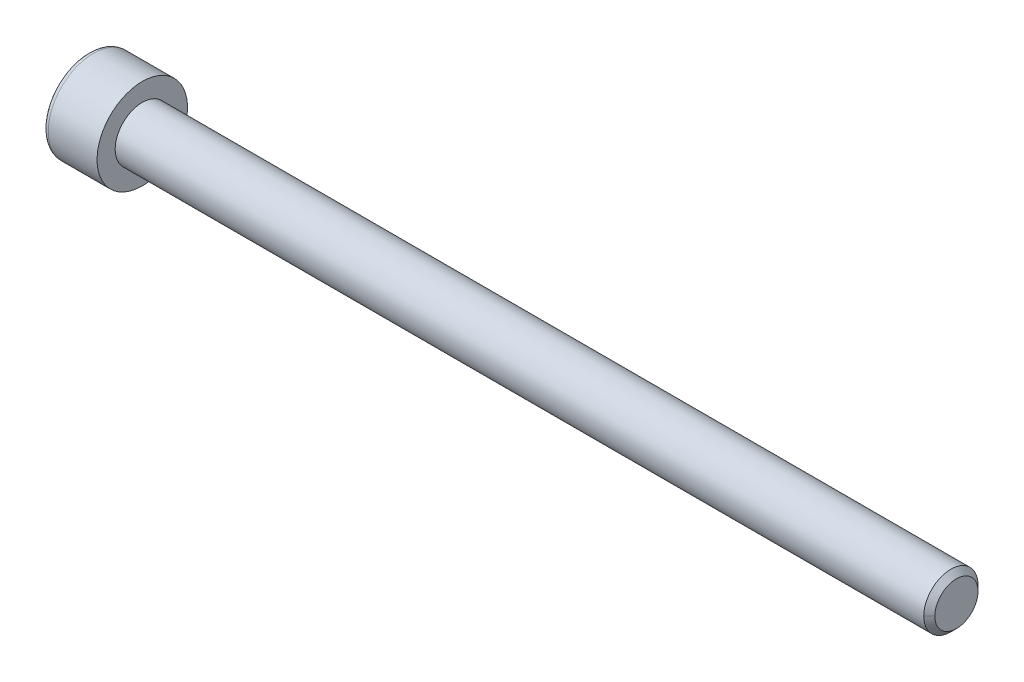
ISO-10303-21;
HEADER;
FILE_DESCRIPTION(('STEP AP214'),'2;1');
FILE_NAME('part.step','',(''),(''),'','','');
FILE_SCHEMA(('AUTOMOTIVE_DESIGN { 1 0 10303 214 1 1 1 1 }'));
ENDSEC;
DATA;
#1=APPLICATION_CONTEXT('core data for automotive mechanical design processes');
#2=APPLICATION_PROTOCOL_DEFINITION('international standard','automotive_design',2000,#1);
#3=PRODUCT_CONTEXT('',#1,'mechanical');
#4=PRODUCT('Part','Part','',(#3));
#5=PRODUCT_RELATED_PRODUCT_CATEGORY('part','',(#4));
#6=PRODUCT_DEFINITION_FORMATION('','',#4);
#7=PRODUCT_DEFINITION_CONTEXT('part definition',#1,'design');
#8=PRODUCT_DEFINITION('design','',#6,#7);
#9=PRODUCT_DEFINITION_SHAPE('','',#8);
#10=(LENGTH_UNIT() NAMED_UNIT(*) SI_UNIT(.MILLI.,.METRE.));
#11=(NAMED_UNIT(*) PLANE_ANGLE_UNIT() SI_UNIT($,.RADIAN.));
#12=(NAMED_UNIT(*) SI_UNIT($,.STERADIAN.) SOLID_ANGLE_UNIT());
#13=UNCERTAINTY_MEASURE_WITH_UNIT(LENGTH_MEASURE(1.E-05),#10,'distance_accuracy_value','');
#14=(GEOMETRIC_REPRESENTATION_CONTEXT(3) GLOBAL_UNCERTAINTY_ASSIGNED_CONTEXT((#13)) GLOBAL_UNIT_ASSIGNED_CONTEXT((#10,
#11,#12)) REPRESENTATION_CONTEXT('',''));
#15=CARTESIAN_POINT('',(0.,0.,0.));
#16=DIRECTION('',(0.,0.,1.));
#17=DIRECTION('',(1.,0.,0.));
#18=AXIS2_PLACEMENT_3D('',#15,#16,#17);
#19=CARTESIAN_POINT('',(90.,-2.4151886,2.4151886));
#20=DIRECTION('',(1.,0.,0.));
#21=DIRECTION('',(0.,1.,0.));
#22=AXIS2_PLACEMENT_3D('',#19,#20,#21);
#23=PLANE('',#22);
#24=CARTESIAN_POINT('',(90.,0.,0.));
#25=DIRECTION('',(1.,0.,0.));
#26=DIRECTION('',(0.,0.,-1.));
#27=AXIS2_PLACEMENT_3D('',#24,#25,#26);
#28=CIRCLE('',#27,2.38655);
#29=CARTESIAN_POINT('',(90.,-8.15815978925338E-10,2.38655000000001));
#30=VERTEX_POINT('',#29);
#31=CARTESIAN_POINT('',(90.,-2.85727898792781E-10,-2.38655000000001));
#32=VERTEX_POINT('',#31);
#33=EDGE_CURVE('E128',#30,#32,#28,.F.);
#34=ORIENTED_EDGE('',*,*,#33,.F.);
#35=CARTESIAN_POINT('',(90.,0.,0.));
#36=DIRECTION('',(1.,0.,0.));
#37=DIRECTION('',(0.,0.,-1.));
#38=AXIS2_PLACEMENT_3D('',#35,#36,#37);
#39=CIRCLE('',#38,2.38655);
#40=EDGE_CURVE('E57',#32,#30,#39,.F.);
#41=ORIENTED_EDGE('',*,*,#40,.F.);
#42=EDGE_LOOP('',(#34,#41));
#43=FACE_BOUND('',#42,.T.);
#44=ADVANCED_FACE('F53',(#43),#23,.T.);
#45=CARTESIAN_POINT('',(90.,0.,-2.38655));
#46=CARTESIAN_POINT('',(89.38655,0.,-3.));
#47=(BOUNDED_CURVE() B_SPLINE_CURVE(1,(#45,#46),.UNSPECIFIED.,.F.,
.F.) B_SPLINE_CURVE_WITH_KNOTS((2,2),(0.,1.00000000000009),
.UNSPECIFIED.) CURVE() GEOMETRIC_REPRESENTATION_ITEM() RATIONAL_B_SPLINE_CURVE((1.,1.)) REPRESENTATION_ITEM(''));
#48=CARTESIAN_POINT('',(1089.38655,0.,0.));
#49=DIRECTION('',(-1.,0.,0.));
#50=AXIS1_PLACEMENT('',#48,#49);
#51=SURFACE_OF_REVOLUTION('',#47,#50);
#52=ORIENTED_EDGE('',*,*,#40,.T.);
#53=DIRECTION('',(0.707106781186548,2.90060050295602E-10,-0.707106781186547));
#54=VECTOR('',#53,1.);
#55=CARTESIAN_POINT('',(89.693275,-1.10479987286926E-09,2.693275));
#56=LINE('',#55,#54);
#57=CARTESIAN_POINT('',(89.38655,-1.23062057109199E-09,3.00000000000002));
#58=VERTEX_POINT('',#57);
#59=EDGE_CURVE('E125',#58,#30,#56,.T.);
#60=ORIENTED_EDGE('',*,*,#59,.F.);
#61=CARTESIAN_POINT('',(89.38655,0.,0.));
#62=DIRECTION('',(1.,0.,0.));
#63=DIRECTION('',(0.,0.,-1.));
#64=AXIS2_PLACEMENT_3D('',#61,#62,#63);
#65=CIRCLE('',#64,3.);
#66=CARTESIAN_POINT('',(89.38655,-2.69379553018573E-10,-3.00000000000002));
#67=VERTEX_POINT('',#66);
#68=EDGE_CURVE('E134',#67,#58,#65,.F.);
#69=ORIENTED_EDGE('',*,*,#68,.F.);
#70=DIRECTION('',(-0.707106781186548,-1.26986739101621E-10,-0.707106781186547));
#71=VECTOR('',#70,1.);
#72=CARTESIAN_POINT('',(89.693275,-4.83675477104059E-10,-2.693275));
#73=LINE('',#72,#71);
#74=EDGE_CURVE('E119',#32,#67,#73,.T.);
#75=ORIENTED_EDGE('',*,*,#74,.F.);
#76=EDGE_LOOP('',(#52,#60,#69,#75));
#77=FACE_BOUND('',#76,.T.);
#78=ADVANCED_FACE('F132',(#77),#51,.T.);
#79=CARTESIAN_POINT('',(90.0001414213562,0.,-2.38640857864376));
#80=CARTESIAN_POINT('',(90.,0.,-2.38655));
#81=CARTESIAN_POINT('',(89.38655,0.,-3.));
#82=(BOUNDED_CURVE() B_SPLINE_CURVE(1,(#79,#80,#81),.UNSPECIFIED.,.F.,
.F.) B_SPLINE_CURVE_WITH_KNOTS((2,1,2),(-0.00023053439469535,5.18446733999951E-11,1.),
.UNSPECIFIED.) CURVE() GEOMETRIC_REPRESENTATION_ITEM() RATIONAL_B_SPLINE_CURVE((1.,1.,1.)) REPRESENTATION_ITEM(''));
#83=CARTESIAN_POINT('',(1089.38655,0.,0.));
#84=DIRECTION('',(-1.,0.,0.));
#85=AXIS1_PLACEMENT('',#83,#84);
#86=SURFACE_OF_REVOLUTION('',#82,#85);
#87=ORIENTED_EDGE('',*,*,#59,.T.);
#88=ORIENTED_EDGE('',*,*,#33,.T.);
#89=ORIENTED_EDGE('',*,*,#74,.T.);
#90=CARTESIAN_POINT('',(89.38655,0.,0.));
#91=DIRECTION('',(1.,0.,0.));
#92=DIRECTION('',(0.,0.,-1.));
#93=AXIS2_PLACEMENT_3D('',#90,#91,#92);
#94=CIRCLE('',#93,3.);
#95=EDGE_CURVE('E129',#58,#67,#94,.F.);
#96=ORIENTED_EDGE('',*,*,#95,.F.);
#97=EDGE_LOOP('',(#87,#88,#89,#96));
#98=FACE_BOUND('',#97,.T.);
#99=ADVANCED_FACE('F126',(#98),#86,.T.);
#100=CARTESIAN_POINT('',(-1.333333333,0.,0.));
#101=CARTESIAN_POINT('',(-3.01,0.,-2.904071854));
#102=(BOUNDED_CURVE() B_SPLINE_CURVE(1,(#100,#101),.UNSPECIFIED.,.F.,
.F.) B_SPLINE_CURVE_WITH_KNOTS((2,2),(0.,1.),
.UNSPECIFIED.) CURVE() GEOMETRIC_REPRESENTATION_ITEM() RATIONAL_B_SPLINE_CURVE((1.,1.)) REPRESENTATION_ITEM(''));
#103=CARTESIAN_POINT('',(996.99,0.,0.));
#104=DIRECTION('',(-1.,0.,0.));
#105=AXIS1_PLACEMENT('',#103,#104);
#106=SURFACE_OF_REVOLUTION('',#102,#105);
#107=CARTESIAN_POINT('',(-1.333333333,0.,0.));
#108=VERTEX_POINT('',#107);
#109=VERTEX_LOOP('',#108);
#110=FACE_BOUND('',#109,.T.);
#111=CARTESIAN_POINT('',(-2.99999999990194,-2.5,1.44337567259391));
#112=CARTESIAN_POINT('',(-2.98209574263693,-2.5,1.38134905294953));
#113=CARTESIAN_POINT('',(-2.96498591501795,-2.5,1.31908524854831));
#114=CARTESIAN_POINT('',(-2.9325586063815,-2.5,1.19402341340579));
#115=CARTESIAN_POINT('',(-2.91724304001177,-2.5,1.13122488732653));
#116=CARTESIAN_POINT('',(-2.88864230481174,-2.5,1.00514627159482));
#117=CARTESIAN_POINT('',(-2.87535773971234,-2.5,0.941866044598566));
#118=CARTESIAN_POINT('',(-2.84501155623976,-2.5,0.783295355537952));
#119=CARTESIAN_POINT('',(-2.82935510407788,-2.5,0.687729720023883));
#120=CARTESIAN_POINT('',(-2.8038363929103,-2.5,0.49582792968208));
#121=CARTESIAN_POINT('',(-2.79397345365601,-2.5,0.399491866661438));
#122=CARTESIAN_POINT('',(-2.78132126682311,-2.5,0.217329774455165));
#123=CARTESIAN_POINT('',(-2.77785668029329,-2.5,0.13155078285884));
#124=CARTESIAN_POINT('',(-2.77604418751081,-2.5,-0.0400958904405022));
#125=CARTESIAN_POINT('',(-2.77769824160356,-2.5,-0.125963593529663));
#126=CARTESIAN_POINT('',(-2.78605196619317,-2.5,-0.297450074329791));
#127=CARTESIAN_POINT('',(-2.79275167480722,-2.5,-0.383068850155342));
#128=CARTESIAN_POINT('',(-2.8108998117244,-2.5,-0.553755303851712));
#129=CARTESIAN_POINT('',(-2.82234605098717,-2.5,-0.638823217429646));
#130=CARTESIAN_POINT('',(-2.84954081955049,-2.5,-0.808258474159647));
#131=CARTESIAN_POINT('',(-2.86528928104194,-2.5,-0.892625828331925));
#132=CARTESIAN_POINT('',(-2.90056247218591,-2.5,-1.06053688925276));
#133=CARTESIAN_POINT('',(-2.92008612509887,-2.5,-1.14408082372909));
#134=CARTESIAN_POINT('',(-2.95044571186063,-2.5,-1.26341360873709));
#135=CARTESIAN_POINT('',(-2.95996603514937,-2.5,-1.29954359668296));
#136=CARTESIAN_POINT('',(-2.9795691964924,-2.5,-1.37159959189587));
#137=CARTESIAN_POINT('',(-2.98965127625646,-2.5,-1.40752580531338));
#138=CARTESIAN_POINT('',(-2.99999999995315,-2.5,-1.44337567277131));
#139=B_SPLINE_CURVE_WITH_KNOTS('',3,(#111,#112,#113,#114,#115,#116,#117,#118,#119,#120,#121,
#122,#123,#124,#125,#126,#127,#128,#129,#130,#131,#132,#133,#134,#135,#136,#137,#138),
.UNSPECIFIED.,.F.,.F.,(4,2,2,2,2,2,2,2,2,2,2,2,2,4),(0.,0.193683427773067,0.38757168712609,
0.581517469676064,0.871873940003063,1.16219631114209,1.41959520256128,1.67709268522974,
1.93459211317248,2.1919729174537,2.44934966528471,2.70665311350898,2.81873929256059,
2.93067767377976),.UNSPECIFIED.);
#140=CARTESIAN_POINT('',(-2.99999999985056,-2.49999999997164,1.44337567301637));
#141=VERTEX_POINT('',#140);
#142=CARTESIAN_POINT('',(-2.9999999999511,-2.49999999989483,-1.44337567294638));
#143=VERTEX_POINT('',#142);
#144=EDGE_CURVE('E489',#141,#143,#139,.T.);
#145=ORIENTED_EDGE('',*,*,#144,.F.);
#146=CARTESIAN_POINT('',(-2.99999999981082,-6.92430306305458E-10,2.88675134560023));
#147=CARTESIAN_POINT('',(-2.98209574255005,-0.0537166290131819,2.85573803577872));
#148=CARTESIAN_POINT('',(-2.96498591493549,-0.107638665358749,2.8246061335788));
#149=CARTESIAN_POINT('',(-2.93255860630814,-0.215945391631711,2.76207521600893));
#150=CARTESIAN_POINT('',(-2.9172430399431,-0.270330510534358,2.73067595297002));
#151=CARTESIAN_POINT('',(-2.88864230475259,-0.379517794627478,2.66763664510564));
#152=CARTESIAN_POINT('',(-2.87535773965803,-0.43432007876117,2.63599653160827));
#153=CARTESIAN_POINT('',(-2.84501155619788,-0.571646323777089,2.55671118708011));
#154=CARTESIAN_POINT('',(-2.82935510404371,-0.654408591857143,2.50892836932449));
#155=CARTESIAN_POINT('',(-2.8038363928916,-0.820600417316618,2.41297747415662));
#156=CARTESIAN_POINT('',(-2.79397345364506,-0.904029895188767,2.36480944264792));
#157=CARTESIAN_POINT('',(-2.78132126682574,-1.06178689464532,2.27372839654349));
#158=CARTESIAN_POINT('',(-2.77785668030231,-1.13607368048253,2.23083890074238));
#159=CARTESIAN_POINT('',(-2.7760441875333,-1.28472406004208,2.14501556408699));
#160=CARTESIAN_POINT('',(-2.77769824163313,-1.35908767228535,2.10208171253965));
#161=CARTESIAN_POINT('',(-2.78605196623694,-1.5075993210704,2.01633847213427));
#162=CARTESIAN_POINT('',(-2.79275167485812,-1.58174735597935,1.97352908421893));
#163=CARTESIAN_POINT('',(-2.81089981178956,-1.72956616096821,1.88818585736579));
#164=CARTESIAN_POINT('',(-2.82234605105948,-1.80323713517648,1.84565190057442));
#165=CARTESIAN_POINT('',(-2.84954081963674,-1.94997237180682,1.76093427220477));
#166=CARTESIAN_POINT('',(-2.86528928113499,-2.02303664377268,1.71875059511638));
#167=CARTESIAN_POINT('',(-2.90056247229208,-2.16845188811155,1.63479506465155));
#168=CARTESIAN_POINT('',(-2.92008612521135,-2.2408030577026,1.59302309741122));
#169=CARTESIAN_POINT('',(-2.95044571196894,-2.34414828098353,1.53335670492944));
#170=CARTESIAN_POINT('',(-2.95996603524654,-2.37543776834049,1.51529171098077));
#171=CARTESIAN_POINT('',(-2.9795691965657,-2.43784009060514,1.47926371342257));
#172=CARTESIAN_POINT('',(-2.98965127631702,-2.46895310404436,1.46130060673781));
#173=CARTESIAN_POINT('',(-3.00000000000026,-2.49999999994328,1.44337567303274));
#174=B_SPLINE_CURVE_WITH_KNOTS('',3,(#146,#147,#148,#149,#150,#151,#152,#153,#154,#155,#156,
#157,#158,#159,#160,#161,#162,#163,#164,#165,#166,#167,#168,#169,#170,#171,#172,#173),
.UNSPECIFIED.,.F.,.F.,(4,2,2,2,2,2,2,2,2,2,2,2,2,4),(0.,0.193683427763163,0.387571687106229,
0.581517469646224,0.871873939957275,1.16219631108039,1.41959520251302,1.67709268519497,
1.93459211315123,2.19197291744619,2.44934966529089,2.70665311352883,2.8187392924298,
2.93067767349862),.UNSPECIFIED.);
#175=CARTESIAN_POINT('',(-3.00000000004163,-1.18416519667169E-09,2.886751346));
#176=VERTEX_POINT('',#175);
#177=EDGE_CURVE('E140',#176,#141,#174,.T.);
#178=ORIENTED_EDGE('',*,*,#177,.F.);
#179=CARTESIAN_POINT('',(-3.00000000004014,2.50000000006292,1.44337567296367));
#180=CARTESIAN_POINT('',(-2.98209574277019,2.44628337173678,1.47438898278829));
#181=CARTESIAN_POINT('',(-2.96498591514619,2.39236133538579,1.50552088499134));
#182=CARTESIAN_POINT('',(-2.93255860649956,2.28405460910186,1.56805180256754));
#183=CARTESIAN_POINT('',(-2.91724304012469,2.22966949019366,1.59945106560966));
#184=CARTESIAN_POINT('',(-2.88864230491419,2.12048220608924,1.66249037348057));
#185=CARTESIAN_POINT('',(-2.87535773980948,2.0656799219498,1.69413048698125));
#186=CARTESIAN_POINT('',(-2.8450115563234,1.92835367691897,1.77341583151802));
#187=CARTESIAN_POINT('',(-2.82935510415318,1.84559140882962,1.82119864927901));
#188=CARTESIAN_POINT('',(-2.80383639296923,1.67939958335076,1.91714954445807));
#189=CARTESIAN_POINT('',(-2.7939734537069,1.59597010546853,1.96531757597259));
#190=CARTESIAN_POINT('',(-2.78132126685985,1.43821310600813,2.05639862207924));
#191=CARTESIAN_POINT('',(-2.77785668032333,1.36392632017731,2.09928811787666));
#192=CARTESIAN_POINT('',(-2.77604418752705,1.21527594062986,2.18511145452507));
#193=CARTESIAN_POINT('',(-2.7776982416127,1.14091232839229,2.22804530606911));
#194=CARTESIAN_POINT('',(-2.78605196618806,0.992400679617963,2.31378854646831));
#195=CARTESIAN_POINT('',(-2.79275167479497,0.918252644714026,2.35659793438075));
#196=CARTESIAN_POINT('',(-2.81089981169805,0.77043383973447,2.44194116122851));
#197=CARTESIAN_POINT('',(-2.82234605095387,0.696762865530502,2.4844751180174));
#198=CARTESIAN_POINT('',(-2.84954081950371,0.55002762890825,2.56919274638238));
#199=CARTESIAN_POINT('',(-2.86528928098864,0.476963356946185,2.61137642346858));
#200=CARTESIAN_POINT('',(-2.90056247212028,0.331548112614633,2.69533195392919));
#201=CARTESIAN_POINT('',(-2.92008612502744,0.259196943027112,2.73710392116748));
#202=CARTESIAN_POINT('',(-2.95044571181407,0.155851719595239,2.79677031373641));
#203=CARTESIAN_POINT('',(-2.95996603513553,0.124562232084562,2.81483530777383));
#204=CARTESIAN_POINT('',(-2.97956919654802,0.0621599095141735,2.85086330550854));
#205=CARTESIAN_POINT('',(-2.98965127634881,0.0310468959229215,2.86882641228108));
#206=CARTESIAN_POINT('',(-3.00000000008409,-1.27376694826501E-10,2.88675134607354));
#207=B_SPLINE_CURVE_WITH_KNOTS('',3,(#179,#180,#181,#182,#183,#184,#185,#186,#187,#188,#189,
#190,#191,#192,#193,#194,#195,#196,#197,#198,#199,#200,#201,#202,#203,#204,#205,#206),
.UNSPECIFIED.,.F.,.F.,(4,2,2,2,2,2,2,2,2,2,2,2,2,4),(0.,0.193683427788764,0.387571687157534,
0.581517469723277,0.87187394007394,1.16219631123659,1.41959520264876,1.67709268531015,
1.93459211324574,2.19197291752029,2.44934966534468,2.70665311356242,2.81873929301174,
2.93067767462766),.UNSPECIFIED.);
#208=CARTESIAN_POINT('',(-2.9999999999511,2.50000000003146,1.44337567270972));
#209=VERTEX_POINT('',#208);
#210=EDGE_CURVE('E142',#209,#176,#207,.T.);
#211=ORIENTED_EDGE('',*,*,#210,.F.);
#212=CARTESIAN_POINT('',(-2.99999999999303,2.5,-1.44337567290945));
#213=CARTESIAN_POINT('',(-2.98209574272447,2.5,-1.38134905326268));
#214=CARTESIAN_POINT('',(-2.96498591510176,2.5,-1.31908524885907));
#215=CARTESIAN_POINT('',(-2.93255860645764,2.5,-1.19402341371172));
#216=CARTESIAN_POINT('',(-2.91724304008399,2.5,-1.13122488763002));
#217=CARTESIAN_POINT('',(-2.88864230487602,2.5,-1.00514627189332));
#218=CARTESIAN_POINT('',(-2.87535773977261,2.5,-0.94186604489453));
#219=CARTESIAN_POINT('',(-2.84501155628974,2.5,-0.783295355827017));
#220=CARTESIAN_POINT('',(-2.82935510412148,2.5,-0.687729720308527));
#221=CARTESIAN_POINT('',(-2.80383639294123,2.5,-0.495827929957529));
#222=CARTESIAN_POINT('',(-2.79397345368064,2.5,-0.399491866932111));
#223=CARTESIAN_POINT('',(-2.78132126683661,2.5,-0.217329774723812));
#224=CARTESIAN_POINT('',(-2.7778566803015,2.5,-0.131550783130307));
#225=CARTESIAN_POINT('',(-2.77604418750818,2.5,0.0400958901637057));
#226=CARTESIAN_POINT('',(-2.77769824159537,2.5,0.125963593250358));
#227=CARTESIAN_POINT('',(-2.7860519661738,2.5,0.29745007404579));
#228=CARTESIAN_POINT('',(-2.79275167478224,2.5,0.383068849869153));
#229=CARTESIAN_POINT('',(-2.81089981168823,2.5,0.553755303561258));
#230=CARTESIAN_POINT('',(-2.82234605094543,2.5,0.638823217137117));
#231=CARTESIAN_POINT('',(-2.84954081949781,2.5,0.808258473863209));
#232=CARTESIAN_POINT('',(-2.8652892809839,2.5,0.892625828033653));
#233=CARTESIAN_POINT('',(-2.90056247211773,2.5,1.06053688895091));
#234=CARTESIAN_POINT('',(-2.9200861250259,2.5,1.14408082342549));
#235=CARTESIAN_POINT('',(-2.95044571178066,2.5,1.26341360843007));
#236=CARTESIAN_POINT('',(-2.95996603506711,2.5,1.29954359637421));
#237=CARTESIAN_POINT('',(-2.97956919640564,2.5,1.37159959158371));
#238=CARTESIAN_POINT('',(-2.9896512761675,2.5,1.40752580499953));
#239=CARTESIAN_POINT('',(-2.99999999986206,2.5,1.44337567245577));
#240=B_SPLINE_CURVE_WITH_KNOTS('',3,(#212,#213,#214,#215,#216,#217,#218,#219,#220,#221,#222,
#223,#224,#225,#226,#227,#228,#229,#230,#231,#232,#233,#234,#235,#236,#237,#238,#239),
.UNSPECIFIED.,.F.,.F.,(4,2,2,2,2,2,2,2,2,2,2,2,2,4),(0.,0.193683427782941,0.387571687145881,
0.581517469705791,0.871873940048986,1.16219631120418,1.41959520261558,1.6770926852762,
1.93459211321108,2.19197291748389,2.44934966530652,2.70665311352239,2.81873929256726,
2.93067767377976),.UNSPECIFIED.);
#241=CARTESIAN_POINT('',(-2.9999999999511,2.49999999983501,-1.44337567304999));
#242=VERTEX_POINT('',#241);
#243=EDGE_CURVE('E521',#242,#209,#240,.T.);
#244=ORIENTED_EDGE('',*,*,#243,.F.);
#245=CARTESIAN_POINT('',(-2.99999999997736,1.9280147525356E-10,-2.88675134588869));
#246=CARTESIAN_POINT('',(-2.98209574271006,0.05371662851739,-2.85573803606497));
#247=CARTESIAN_POINT('',(-2.96498591508868,0.107638664866787,-2.82460613386283));
#248=CARTESIAN_POINT('',(-2.93255860644731,0.215945391147497,-2.76207521628849));
#249=CARTESIAN_POINT('',(-2.91724304007509,0.27033051005406,-2.73067595324732));
#250=CARTESIAN_POINT('',(-2.88864230487006,0.379517794155173,-2.66763664537832));
#251=CARTESIAN_POINT('',(-2.87535773976816,0.434320078292939,-2.63599653187861));
#252=CARTESIAN_POINT('',(-2.8450115562892,0.57164632331975,-2.55671118734415));
#253=CARTESIAN_POINT('',(-2.82935510412338,0.65440859140672,-2.50892836958454));
#254=CARTESIAN_POINT('',(-2.80383639294808,0.820600416880588,-2.41297747440836));
#255=CARTESIAN_POINT('',(-2.79397345369,0.904029894760213,-2.36480944289534));
#256=CARTESIAN_POINT('',(-2.78132126685048,1.06178689421983,-2.27372839678915));
#257=CARTESIAN_POINT('',(-2.77785668031755,1.13607368005252,-2.23083890099064));
#258=CARTESIAN_POINT('',(-2.77604418752874,1.28472405960351,-2.1450155643402));
#259=CARTESIAN_POINT('',(-2.77769824161827,1.35908767184276,-2.10208171279518));
#260=CARTESIAN_POINT('',(-2.78605196620148,1.50759932062025,-2.01633847239416));
#261=CARTESIAN_POINT('',(-2.79275167481235,1.58174735552568,-1.97352908448086));
#262=CARTESIAN_POINT('',(-2.81089981172326,1.7295661605078,-1.88818585763161));
#263=CARTESIAN_POINT('',(-2.82234605098294,1.80323713471284,-1.84565190084211));
#264=CARTESIAN_POINT('',(-2.8495408195403,1.94997237133708,-1.76093427247597));
#265=CARTESIAN_POINT('',(-2.86528928102888,2.02303664330007,-1.71875059538924));
#266=CARTESIAN_POINT('',(-2.90056247216742,2.1684518876334,-1.63479506492761));
#267=CARTESIAN_POINT('',(-2.92008612507781,2.24080305722177,-1.59302309768883));
#268=CARTESIAN_POINT('',(-2.95044571183394,2.34414828053542,-1.53335670518816));
#269=CARTESIAN_POINT('',(-2.95996603511936,2.37543776792759,-1.51529171121916));
#270=CARTESIAN_POINT('',(-2.97956919645556,2.4378400902623,-1.47926371362051));
#271=CARTESIAN_POINT('',(-2.9896512762161,2.46895310373638,-1.46130060691562));
#272=CARTESIAN_POINT('',(-2.99999999990917,2.49999999967002,-1.44337567319052));
#273=B_SPLINE_CURVE_WITH_KNOTS('',3,(#245,#246,#247,#248,#249,#250,#251,#252,#253,#254,#255,
#256,#257,#258,#259,#260,#261,#262,#263,#264,#265,#266,#267,#268,#269,#270,#271,#272),
.UNSPECIFIED.,.F.,.F.,(4,2,2,2,2,2,2,2,2,2,2,2,2,4),(0.,0.193683427781386,0.387571687142756,
0.581517469701091,0.871873940041472,1.16219631119386,1.41959520261202,1.67709268527943,
1.93459211322111,2.19197291750089,2.44934966533046,2.70665311355327,2.81873929257813,
2.93067767377066),.UNSPECIFIED.);
#274=CARTESIAN_POINT('',(-3.0000000000959,-1.62810287944994E-10,-2.886751346094));
#275=VERTEX_POINT('',#274);
#276=EDGE_CURVE('E511',#275,#242,#273,.T.);
#277=ORIENTED_EDGE('',*,*,#276,.F.);
#278=CARTESIAN_POINT('',(-2.99999999994905,-2.49999999978965,-1.44337567312145));
#279=CARTESIAN_POINT('',(-2.98209574268285,-2.44628337146572,-1.47438898294478));
#280=CARTESIAN_POINT('',(-2.96498591506263,-2.39236133511698,-1.50552088514654));
#281=CARTESIAN_POINT('',(-2.93255860642365,-2.2840546088376,-1.56805180272011));
#282=CARTESIAN_POINT('',(-2.91724304005265,-2.22966948993171,-1.5994510657609));
#283=CARTESIAN_POINT('',(-2.88864230485011,-2.12048220583196,-1.66249037362911));
#284=CARTESIAN_POINT('',(-2.87535773974946,-2.06567992169489,-1.69413048712842));
#285=CARTESIAN_POINT('',(-2.84501155627371,-1.92835367666992,-1.77341583166181));
#286=CARTESIAN_POINT('',(-2.82935510410985,-1.84559140858412,-1.82119864942075));
#287=CARTESIAN_POINT('',(-2.80383639293848,-1.67939958311269,-1.91714954459552));
#288=CARTESIAN_POINT('',(-2.79397345368236,-1.59597010523433,-1.96531757610781));
#289=CARTESIAN_POINT('',(-2.78132126684628,-1.43821310577522,-2.05639862221371));
#290=CARTESIAN_POINT('',(-2.77785668031497,-1.36392631994176,-2.09928811801266));
#291=CARTESIAN_POINT('',(-2.77604418752952,-1.2152759403893,-2.18511145466395));
#292=CARTESIAN_POINT('',(-2.77769824162078,-1.14091232814936,-2.22804530620937));
#293=CARTESIAN_POINT('',(-2.78605196620749,-0.992400679370574,-2.31378854661114));
#294=CARTESIAN_POINT('',(-2.79275167482015,-0.918252644464542,-2.35659793452478));
#295=CARTESIAN_POINT('',(-2.81089981173457,-0.770433839481277,-2.44194116137469));
#296=CARTESIAN_POINT('',(-2.82234605099598,-0.696762865275693,-2.48447511816451));
#297=CARTESIAN_POINT('',(-2.8495408195567,-0.550027628650418,-2.56919274653124));
#298=CARTESIAN_POINT('',(-2.86528928104691,-0.476963356686943,-2.61137642361826));
#299=CARTESIAN_POINT('',(-2.90056247218859,-0.331548112352686,-2.69533195408042));
#300=CARTESIAN_POINT('',(-2.9200861251005,-0.259196942763867,-2.73710392131946));
#301=CARTESIAN_POINT('',(-2.95044571185584,-0.155851719459382,-2.79677031381484));
#302=CARTESIAN_POINT('',(-2.95996603513881,-0.124562232076772,-2.81483530777832));
#303=CARTESIAN_POINT('',(-2.97956919646974,-0.0621599097610845,-2.85086330536599));
#304=CARTESIAN_POINT('',(-2.98965127622746,-0.0310468962964689,-2.86882641206541));
#305=CARTESIAN_POINT('',(-2.99999999991754,-3.72252951759761E-10,-2.88675134578508));
#306=B_SPLINE_CURVE_WITH_KNOTS('',3,(#278,#279,#280,#281,#282,#283,#284,#285,#286,#287,#288,
#289,#290,#291,#292,#293,#294,#295,#296,#297,#298,#299,#300,#301,#302,#303,#304,#305),
.UNSPECIFIED.,.F.,.F.,(4,2,2,2,2,2,2,2,2,2,2,2,2,4),(0.,0.193683427778269,0.387571687136511,
0.581517469691713,0.871873940027135,1.16219631117457,1.41959520259521,1.67709268526511,
1.93459211320929,2.19197291749163,2.44934966532376,2.70665311354912,2.81873929254008,
2.93067767369877),.UNSPECIFIED.);
#307=EDGE_CURVE('E499',#143,#275,#306,.T.);
#308=ORIENTED_EDGE('',*,*,#307,.F.);
#309=EDGE_LOOP('',(#145,#178,#211,#244,#277,#308));
#310=FACE_BOUND('',#309,.T.);
#311=ADVANCED_FACE('F160',(#110,#310),#106,.F.);
#312=CARTESIAN_POINT('',(0.,3.,0.));
#313=CARTESIAN_POINT('',(89.38655,3.,0.));
#314=(BOUNDED_CURVE() B_SPLINE_CURVE(1,(#312,#313),.UNSPECIFIED.,.F.,
.F.) B_SPLINE_CURVE_WITH_KNOTS((2,2),(0.,1.),
.UNSPECIFIED.) CURVE() GEOMETRIC_REPRESENTATION_ITEM() RATIONAL_B_SPLINE_CURVE((1.,1.)) REPRESENTATION_ITEM(''));
#315=CARTESIAN_POINT('',(78.,0.,0.));
#316=DIRECTION('',(1.,0.,0.));
#317=AXIS1_PLACEMENT('',#315,#316);
#318=SURFACE_OF_REVOLUTION('',#314,#317);
#319=CARTESIAN_POINT('',(0.,3.,1.79585082180927E-10));
#320=CARTESIAN_POINT('',(0.,2.99999949522854,0.0842305921750378));
#321=CARTESIAN_POINT('',(0.,2.99644943210249,0.168476663816767));
#322=CARTESIAN_POINT('',(0.,2.98227226002267,0.336386615205739));
#323=CARTESIAN_POINT('',(0.,2.97164306170328,0.420050315701042));
#324=CARTESIAN_POINT('',(0.,2.9433554403765,0.586325719994559));
#325=CARTESIAN_POINT('',(0.,2.92568585927662,0.668935538006743));
#326=CARTESIAN_POINT('',(0.,2.88343927181851,0.832418927670488));
#327=CARTESIAN_POINT('',(0.,2.85885666003996,0.913291032780675));
#328=CARTESIAN_POINT('',(0.,2.77507914668652,1.15208821042353));
#329=CARTESIAN_POINT('',(0.,2.70578575357263,1.30659602074704));
#330=CARTESIAN_POINT('',(0.,2.54220609659893,1.60176804528835));
#331=CARTESIAN_POINT('',(0.,2.44791888265401,1.7424317329735));
#332=CARTESIAN_POINT('',(0.,2.2898892514552,1.9399880430317));
#333=CARTESIAN_POINT('',(0.,2.23440451662689,2.00363749105151));
#334=CARTESIAN_POINT('',(0.,2.11831409184965,2.12599212156537));
#335=CARTESIAN_POINT('',(0.,2.05771339085062,2.18470201190841));
#336=CARTESIAN_POINT('',(0.,1.93175254690532,2.29683361022014));
#337=CARTESIAN_POINT('',(0.,1.86639026040711,2.35025291063919));
#338=CARTESIAN_POINT('',(0.,1.7314038327038,2.45140072832907));
#339=CARTESIAN_POINT('',(0.,1.6617787079112,2.49912792468452));
#340=CARTESIAN_POINT('',(0.,1.44726826368351,2.63320682475734));
#341=CARTESIAN_POINT('',(0.,1.29661475805599,2.71057412209261));
#342=CARTESIAN_POINT('',(0.,0.984538397769613,2.83887092032264));
#343=CARTESIAN_POINT('',(0.,0.823115658151992,2.88980070358241));
#344=CARTESIAN_POINT('',(0.,0.493990143211312,2.96385049100085));
#345=CARTESIAN_POINT('',(0.,0.326287334354949,2.98697034664271));
#346=CARTESIAN_POINT('',(0.,-0.0106192603936318,3.00472003813866));
#347=CARTESIAN_POINT('',(0.,-0.17982304628585,2.99934987399276));
#348=CARTESIAN_POINT('',(0.,-0.514907479752218,2.96029352943515));
#349=CARTESIAN_POINT('',(0.,-0.680788145068337,2.92660750024165));
#350=CARTESIAN_POINT('',(0.,-1.00461791765848,2.83181297787941));
#351=CARTESIAN_POINT('',(0.,-1.16256694019818,2.77070419182062));
#352=CARTESIAN_POINT('',(0.,-1.38997847831572,2.65990764648401));
#353=CARTESIAN_POINT('',(0.,-1.4642331937897,2.61976066024325));
#354=CARTESIAN_POINT('',(0.,-1.60910065479403,2.533356751595));
#355=CARTESIAN_POINT('',(0.,-1.67971423966904,2.48710124614281));
#356=CARTESIAN_POINT('',(0.,-1.81676022403913,2.38882598111958));
#357=CARTESIAN_POINT('',(0.,-1.88319450224164,2.33680884100812));
#358=CARTESIAN_POINT('',(0.,-2.01149891436323,2.22732998385631));
#359=CARTESIAN_POINT('',(0.,-2.07336458163727,2.16986306080548));
#360=CARTESIAN_POINT('',(0.,-2.25127799284035,1.99000567815265));
#361=CARTESIAN_POINT('',(0.,-2.35982375483851,1.86002810586064));
#362=CARTESIAN_POINT('',(0.,-2.55351363036695,1.58367858014144));
#363=CARTESIAN_POINT('',(0.,-2.63865863339631,1.43730725016412));
#364=CARTESIAN_POINT('',(0.,-2.74706444478656,1.20863511838851));
#365=CARTESIAN_POINT('',(0.,-2.78000876483221,1.13079377999063));
#366=CARTESIAN_POINT('',(0.,-2.83919981745005,0.972654562407022));
#367=CARTESIAN_POINT('',(0.,-2.86545197031175,0.892358730644588));
#368=CARTESIAN_POINT('',(0.,-2.91105470876429,0.729976188975372));
#369=CARTESIAN_POINT('',(0.,-2.93041619252482,0.647892526873583));
#370=CARTESIAN_POINT('',(0.,-2.96215834911786,0.482401803634151));
#371=CARTESIAN_POINT('',(0.,-2.97454108091422,0.398995140300326));
#372=CARTESIAN_POINT('',(0.,-2.98892380783833,0.262882669770961));
#373=CARTESIAN_POINT('',(0.,-2.99307606546448,0.210394788269591));
#374=CARTESIAN_POINT('',(0.,-2.99861431926428,0.105273286690342));
#375=CARTESIAN_POINT('',(0.,-3.00000031543792,0.0526396666124634));
#376=CARTESIAN_POINT('',(0.,-2.99999949525662,-0.08423059117464));
#377=CARTESIAN_POINT('',(0.,-2.99644943215868,-0.168476662817318));
#378=CARTESIAN_POINT('',(0.,-2.98227226013492,-0.336386614210605));
#379=CARTESIAN_POINT('',(0.,-2.97164306184346,-0.420050314709274));
#380=CARTESIAN_POINT('',(0.,-2.94335544057218,-0.586325719012307));
#381=CARTESIAN_POINT('',(0.,-2.92568585949981,-0.668935537030642));
#382=CARTESIAN_POINT('',(0.,-2.88343927209611,-0.832418926708934));
#383=CARTESIAN_POINT('',(0.,-2.85885666034446,-0.913291031827523));
#384=CARTESIAN_POINT('',(0.,-2.77507914707055,-1.15208820949849));
#385=CARTESIAN_POINT('',(0.,-2.70578575400817,-1.30659601984509));
#386=CARTESIAN_POINT('',(0.,-2.54220609713286,-1.60176804444093));
#387=CARTESIAN_POINT('',(0.,-2.44791888323482,-1.74243173215752));
#388=CARTESIAN_POINT('',(0.,-2.28988925210187,-1.93998804226839));
#389=CARTESIAN_POINT('',(0.,-2.23440451729478,-2.00363749030669));
#390=CARTESIAN_POINT('',(0.,-2.11831409255835,-2.12599212085923));
#391=CARTESIAN_POINT('',(0.,-2.0577133915789,-2.18470201122247));
#392=CARTESIAN_POINT('',(0.,-1.93175254767098,-2.29683360957618));
#393=CARTESIAN_POINT('',(0.,-1.86639026119057,-2.35025291001703));
#394=CARTESIAN_POINT('',(0.,-1.73140383352095,-2.45140072775192));
#395=CARTESIAN_POINT('',(0.,-1.66177870874426,-2.49912792413059));
#396=CARTESIAN_POINT('',(0.,-1.44726826456124,-2.63320682427492));
#397=CARTESIAN_POINT('',(0.,-1.2966147589595,-2.71057412166041));
#398=CARTESIAN_POINT('',(0.,-0.984538398715892,-2.83887091999447));
#399=CARTESIAN_POINT('',(0.,-0.823115659115253,-2.88980070330804));
#400=CARTESIAN_POINT('',(0.,-0.493990144199262,-2.96385049083619));
#401=CARTESIAN_POINT('',(0.,-0.326287335350607,-2.98697034653395));
#402=CARTESIAN_POINT('',(0.,0.0106192593920578,-3.0047200381422));
#403=CARTESIAN_POINT('',(0.,0.179823045286068,-2.99934987405271));
#404=CARTESIAN_POINT('',(0.,0.514907478765461,-2.96029352960678));
#405=CARTESIAN_POINT('',(0.,0.680788144092814,-2.92660750046858));
#406=CARTESIAN_POINT('',(0.,1.00461791671455,-2.83181297821428));
#407=CARTESIAN_POINT('',(0.,1.16256693927462,-2.77070419220814));
#408=CARTESIAN_POINT('',(0.,1.38997847742907,-2.65990764694734));
#409=CARTESIAN_POINT('',(0.,1.46423319291643,-2.61976066073134));
#410=CARTESIAN_POINT('',(0.,1.60910065394954,-2.53335675213139));
#411=CARTESIAN_POINT('',(0.,1.67971423883995,-2.48710124670275));
#412=CARTESIAN_POINT('',(0.,1.8167602232428,-2.3888259817252));
#413=CARTESIAN_POINT('',(0.,1.88319450146267,-2.33680884163588));
#414=CARTESIAN_POINT('',(0.,2.01149891362077,-2.22732998452683));
#415=CARTESIAN_POINT('',(0.,2.07336458091398,-2.16986306149661));
#416=CARTESIAN_POINT('',(0.,2.25127799217701,-1.99000567890308));
#417=CARTESIAN_POINT('',(0.,2.35982375421849,-1.86002810664727));
#418=CARTESIAN_POINT('',(0.,2.55351362983904,-1.58367858099263));
#419=CARTESIAN_POINT('',(0.,2.63865863291721,-1.43730725104369));
#420=CARTESIAN_POINT('',(0.,2.74706444438358,-1.20863511930439));
#421=CARTESIAN_POINT('',(0.,2.78000876445511,-1.13079378091769));
#422=CARTESIAN_POINT('',(0.,2.83919981712553,-0.972654563354269));
#423=CARTESIAN_POINT('',(0.,2.86545197001395,-0.892358731600842));
#424=CARTESIAN_POINT('',(0.,2.91105470852067,-0.729976189946921));
#425=CARTESIAN_POINT('',(0.,2.93041619230863,-0.647892527851415));
#426=CARTESIAN_POINT('',(0.,2.96215834895697,-0.482401804622164));
#427=CARTESIAN_POINT('',(0.,2.97454108078118,-0.398995141292236));
#428=CARTESIAN_POINT('',(0.,2.98892380778573,-0.262882670435773));
#429=CARTESIAN_POINT('',(0.,2.99307606544695,-0.210394788602459));
#430=CARTESIAN_POINT('',(0.,2.99861431928182,-0.105273286357475));
#431=CARTESIAN_POINT('',(0.,3.00000031545547,-0.0526396659458053));
#432=CARTESIAN_POINT('',(0.,3.,1.79585082180927E-10));
#433=B_SPLINE_CURVE_WITH_KNOTS('',3,(#319,#320,#321,#322,#323,#324,#325,#326,#327,#328,#329,
#330,#331,#332,#333,#334,#335,#336,#337,#338,#339,#340,#341,#342,#343,#344,#345,#346,#347,#348,
#349,#350,#351,#352,#353,#354,#355,#356,#357,#358,#359,#360,#361,#362,#363,#364,#365,#366,#367,
#368,#369,#370,#371,#372,#373,#374,#375,#376,#377,#378,#379,#380,#381,#382,#383,#384,#385,#386,
#387,#388,#389,#390,#391,#392,#393,#394,#395,#396,#397,#398,#399,#400,#401,#402,#403,#404,#405,
#406,#407,#408,#409,#410,#411,#412,#413,#414,#415,#416,#417,#418,#419,#420,#421,#422,#423,#424,
#425,#426,#427,#428,#429,#430,#431,#432),.UNSPECIFIED.,.T.,.F.,(4,2,2,2,2,2,2,2,2,2,2,2,2,2,2,2,
2,2,2,2,2,2,2,2,2,2,2,2,2,2,2,2,2,2,2,2,2,2,2,2,2,2,2,2,2,2,2,2,2,2,2,2,2,2,2,2,4),(0.,
0.252643316184543,0.505361231639865,0.758481275542631,1.01180715618274,1.51725134291917,
2.02271474576027,2.27577762012549,2.52859650376464,2.78152991223796,3.03452190295018,
3.53997839705089,4.04542949252892,4.55088328731834,5.05633708210776,5.56178817758577,
6.0672446716865,6.32023666239877,6.57317007087212,6.82598895451123,7.07905182887641,
7.58451523171754,8.08995941845395,8.34328529909469,8.59640534299822,8.84912325845305,
9.10176657463668,9.25965528719948,9.41754399976228,9.67018731594591,9.92290523140074,
10.1760252753043,10.429351155945,10.9347953426814,11.4402587455226,11.6933216198877,
11.9461405035268,12.1990739120002,12.4520659027125,12.9575223968132,13.4629734922912,
13.9684272870806,14.47388108187,14.9793321773481,15.4847886714488,15.737780662161,
15.9907140706343,16.2435329542735,16.4965958286387,17.0020592314798,17.5075034182162,
17.7608292988563,18.0139493427591,18.2666672582144,18.519310574399,18.6771992879614,
18.8350880015239),.UNSPECIFIED.);
#434=CARTESIAN_POINT('',(0.,3.,1.79585082180927E-10));
#435=VERTEX_POINT('',#434);
#436=EDGE_CURVE('E476',#435,#435,#433,.T.);
#437=ORIENTED_EDGE('',*,*,#436,.T.);
#438=EDGE_LOOP('',(#437));
#439=FACE_BOUND('',#438,.T.);
#440=ORIENTED_EDGE('',*,*,#68,.T.);
#441=ORIENTED_EDGE('',*,*,#95,.T.);
#442=EDGE_LOOP('',(#440,#441));
#443=FACE_BOUND('',#442,.T.);
#444=ADVANCED_FACE('F139',(#439,#443),#318,.T.);
#445=CARTESIAN_POINT('',(-6.,-2.5,1.443375673));
#446=DIRECTION('',(0.,-0.500000000006738,0.866025403780548));
#447=DIRECTION('',(0.,0.866025403780548,0.500000000006738));
#448=AXIS2_PLACEMENT_3D('',#445,#446,#447);
#449=PLANE('',#448);
#450=DIRECTION('',(0.,0.866025403780548,0.500000000006738));
#451=VECTOR('',#450,1.);
#452=CARTESIAN_POINT('',(-6.,-2.50000000332919,1.44337567107789));
#453=LINE('',#452,#451);
#454=CARTESIAN_POINT('',(-6.,-2.5,1.443375673));
#455=VERTEX_POINT('',#454);
#456=CARTESIAN_POINT('',(-6.,0.,2.886751346));
#457=VERTEX_POINT('',#456);
#458=EDGE_CURVE('E483',#455,#457,#453,.T.);
#459=ORIENTED_EDGE('',*,*,#458,.T.);
#460=DIRECTION('',(1.,0.,0.));
#461=VECTOR('',#460,1.);
#462=CARTESIAN_POINT('',(-6.,0.,2.886751346));
#463=LINE('',#462,#461);
#464=EDGE_CURVE('E527',#176,#457,#463,.F.);
#465=ORIENTED_EDGE('',*,*,#464,.F.);
#466=ORIENTED_EDGE('',*,*,#177,.T.);
#467=DIRECTION('',(1.,0.,0.));
#468=VECTOR('',#467,1.);
#469=CARTESIAN_POINT('',(-6.,-2.5,1.443375673));
#470=LINE('',#469,#468);
#471=EDGE_CURVE('E484',#455,#141,#470,.T.);
#472=ORIENTED_EDGE('',*,*,#471,.F.);
#473=EDGE_LOOP('',(#459,#465,#466,#472));
#474=FACE_BOUND('',#473,.T.);
#475=ADVANCED_FACE('F157',(#474),#449,.F.);
#476=CARTESIAN_POINT('',(-6.,0.,2.886751346));
#477=DIRECTION('',(0.,0.500000000006738,0.866025403780548));
#478=DIRECTION('',(0.,0.866025403780548,-0.500000000006738));
#479=AXIS2_PLACEMENT_3D('',#476,#477,#478);
#480=PLANE('',#479);
#481=DIRECTION('',(0.,0.866025403780548,-0.500000000006738));
#482=VECTOR('',#481,1.);
#483=CARTESIAN_POINT('',(-6.,3.35008062957165E-10,2.88675134580658));
#484=LINE('',#483,#482);
#485=CARTESIAN_POINT('',(-6.,2.5,1.443375673));
#486=VERTEX_POINT('',#485);
#487=EDGE_CURVE('E539',#457,#486,#484,.T.);
#488=ORIENTED_EDGE('',*,*,#487,.T.);
#489=DIRECTION('',(1.,0.,0.));
#490=VECTOR('',#489,1.);
#491=CARTESIAN_POINT('',(-6.,2.5,1.443375673));
#492=LINE('',#491,#490);
#493=EDGE_CURVE('E518',#209,#486,#492,.F.);
#494=ORIENTED_EDGE('',*,*,#493,.F.);
#495=ORIENTED_EDGE('',*,*,#210,.T.);
#496=ORIENTED_EDGE('',*,*,#464,.T.);
#497=EDGE_LOOP('',(#488,#494,#495,#496));
#498=FACE_BOUND('',#497,.T.);
#499=ADVANCED_FACE('F232',(#498),#480,.F.);
#500=CARTESIAN_POINT('',(-6.,2.5,1.443375673));
#501=DIRECTION('',(0.,1.,0.));
#502=DIRECTION('',(0.,0.,-1.));
#503=AXIS2_PLACEMENT_3D('',#500,#501,#502);
#504=PLANE('',#503);
#505=DIRECTION('',(0.,0.,-1.));
#506=VECTOR('',#505,1.);
#507=CARTESIAN_POINT('',(-6.,2.5,4.452851156));
#508=LINE('',#507,#506);
#509=CARTESIAN_POINT('',(-6.,2.5,-1.443375673));
#510=VERTEX_POINT('',#509);
#511=EDGE_CURVE('E540',#486,#510,#508,.T.);
#512=ORIENTED_EDGE('',*,*,#511,.T.);
#513=DIRECTION('',(1.,0.,0.));
#514=VECTOR('',#513,1.);
#515=CARTESIAN_POINT('',(-6.,2.5,-1.443375673));
#516=LINE('',#515,#514);
#517=EDGE_CURVE('E506',#242,#510,#516,.F.);
#518=ORIENTED_EDGE('',*,*,#517,.F.);
#519=ORIENTED_EDGE('',*,*,#243,.T.);
#520=ORIENTED_EDGE('',*,*,#493,.T.);
#521=EDGE_LOOP('',(#512,#518,#519,#520));
#522=FACE_BOUND('',#521,.T.);
#523=ADVANCED_FACE('F240',(#522),#504,.F.);
#524=CARTESIAN_POINT('',(-6.,2.5,-1.443375673));
#525=DIRECTION('',(0.,0.500000000006738,-0.866025403780548));
#526=DIRECTION('',(0.,-0.866025403780548,-0.500000000006738));
#527=AXIS2_PLACEMENT_3D('',#524,#525,#526);
#528=PLANE('',#527);
#529=DIRECTION('',(0.,-0.866025403780548,-0.500000000006738));
#530=VECTOR('',#529,1.);
#531=CARTESIAN_POINT('',(-6.,2.50000000218616,-1.44337567173782));
#532=LINE('',#531,#530);
#533=CARTESIAN_POINT('',(-6.,0.,-2.886751346));
#534=VERTEX_POINT('',#533);
#535=EDGE_CURVE('E542',#510,#534,#532,.T.);
#536=ORIENTED_EDGE('',*,*,#535,.T.);
#537=DIRECTION('',(1.,0.,0.));
#538=VECTOR('',#537,1.);
#539=CARTESIAN_POINT('',(-6.,0.,-2.886751346));
#540=LINE('',#539,#538);
#541=EDGE_CURVE('E496',#275,#534,#540,.F.);
#542=ORIENTED_EDGE('',*,*,#541,.F.);
#543=ORIENTED_EDGE('',*,*,#276,.T.);
#544=ORIENTED_EDGE('',*,*,#517,.T.);
#545=EDGE_LOOP('',(#536,#542,#543,#544));
#546=FACE_BOUND('',#545,.T.);
#547=ADVANCED_FACE('F248',(#546),#528,.F.);
#548=CARTESIAN_POINT('',(-6.,0.,-2.886751346));
#549=DIRECTION('',(0.,-0.500000000006738,-0.866025403780548));
#550=DIRECTION('',(0.,-0.866025403780548,0.500000000006738));
#551=AXIS2_PLACEMENT_3D('',#548,#549,#550);
#552=PLANE('',#551);
#553=DIRECTION('',(0.,-0.866025403780548,0.500000000006738));
#554=VECTOR('',#553,1.);
#555=CARTESIAN_POINT('',(-6.,-1.47803644323652E-09,-2.88675134514666));
#556=LINE('',#555,#554);
#557=CARTESIAN_POINT('',(-6.,-2.5,-1.443375673));
#558=VERTEX_POINT('',#557);
#559=EDGE_CURVE('E546',#534,#558,#556,.T.);
#560=ORIENTED_EDGE('',*,*,#559,.T.);
#561=DIRECTION('',(1.,0.,0.));
#562=VECTOR('',#561,1.);
#563=CARTESIAN_POINT('',(-6.,-2.5,-1.443375673));
#564=LINE('',#563,#562);
#565=EDGE_CURVE('E487',#143,#558,#564,.F.);
#566=ORIENTED_EDGE('',*,*,#565,.F.);
#567=ORIENTED_EDGE('',*,*,#307,.T.);
#568=ORIENTED_EDGE('',*,*,#541,.T.);
#569=EDGE_LOOP('',(#560,#566,#567,#568));
#570=FACE_BOUND('',#569,.T.);
#571=ADVANCED_FACE('F257',(#570),#552,.F.);
#572=CARTESIAN_POINT('',(-6.,-2.5,-1.443375673));
#573=DIRECTION('',(0.,-1.,0.));
#574=DIRECTION('',(0.,0.,1.));
#575=AXIS2_PLACEMENT_3D('',#572,#573,#574);
#576=PLANE('',#575);
#577=DIRECTION('',(0.,0.,-1.));
#578=VECTOR('',#577,1.);
#579=CARTESIAN_POINT('',(-6.,-2.5,4.452851156));
#580=LINE('',#579,#578);
#581=EDGE_CURVE('E72',#558,#455,#580,.F.);
#582=ORIENTED_EDGE('',*,*,#581,.T.);
#583=ORIENTED_EDGE('',*,*,#471,.T.);
#584=ORIENTED_EDGE('',*,*,#144,.T.);
#585=ORIENTED_EDGE('',*,*,#565,.T.);
#586=EDGE_LOOP('',(#582,#583,#584,#585));
#587=FACE_BOUND('',#586,.T.);
#588=ADVANCED_FACE('F266',(#587),#576,.F.);
#589=CARTESIAN_POINT('',(0.,-5.06,5.06));
#590=DIRECTION('',(1.,0.,0.));
#591=DIRECTION('',(0.,1.,0.));
#592=AXIS2_PLACEMENT_3D('',#589,#590,#591);
#593=PLANE('',#592);
#594=ORIENTED_EDGE('',*,*,#436,.F.);
#595=EDGE_LOOP('',(#594));
#596=FACE_BOUND('',#595,.T.);
#597=CARTESIAN_POINT('',(0.,-5.,1.36735672614309E-09));
#598=CARTESIAN_POINT('',(0.,-4.99999915873093,0.1403843213387));
#599=CARTESIAN_POINT('',(0.,-4.99408238702102,0.280794440666639));
#600=CARTESIAN_POINT('',(0.,-4.9704537663411,0.560644359832753));
#601=CARTESIAN_POINT('',(0.,-4.95273843509479,0.700083860917793));
#602=CARTESIAN_POINT('',(0.,-4.90559240134803,0.977209534013473));
#603=CARTESIAN_POINT('',(0.,-4.8761431020319,1.11489256304542));
#604=CARTESIAN_POINT('',(0.,-4.80573211592266,1.3873648818192));
#605=CARTESIAN_POINT('',(0.,-4.76476108675255,1.5221517273292));
#606=CARTESIAN_POINT('',(0.,-4.62513193664993,1.92014700836385));
#607=CARTESIAN_POINT('',(0.,-4.50964306355637,2.17765998099878));
#608=CARTESIAN_POINT('',(0.,-4.2370100190221,2.66961346426397));
#609=CARTESIAN_POINT('',(0.,-4.07986426408667,2.90405309734733));
#610=CARTESIAN_POINT('',(0.,-3.81648235527979,3.23331330163833));
#611=CARTESIAN_POINT('',(0.,-3.72400830254342,3.33939552006088));
#612=CARTESIAN_POINT('',(0.,-3.53052271086168,3.54332050222846));
#613=CARTESIAN_POINT('',(0.,-3.42951948930152,3.64117111143619));
#614=CARTESIAN_POINT('',(0.,-3.21959040664394,3.82805492637088));
#615=CARTESIAN_POINT('',(0.,-3.11066097738325,3.91708411780892));
#616=CARTESIAN_POINT('',(0.,-2.88566250698332,4.08567194936108));
#617=CARTESIAN_POINT('',(0.,-2.76959181807259,4.16522839121251));
#618=CARTESIAN_POINT('',(0.,-2.5312001007099,4.3142530219406));
#619=CARTESIAN_POINT('',(0.,-2.40888119646335,4.38372460891051));
#620=CARTESIAN_POINT('',(0.,-2.15878295258326,4.51214208445818));
#621=CARTESIAN_POINT('',(0.,-2.03100161745775,4.57108408501734));
#622=CARTESIAN_POINT('',(0.,-1.77096719306665,4.67797171401264));
#623=CARTESIAN_POINT('',(0.,-1.63871583022658,4.72592153342911));
#624=CARTESIAN_POINT('',(0.,-1.37062989563233,4.81052635476596));
#625=CARTESIAN_POINT('',(0.,-1.23479400153465,4.8471771233692));
#626=CARTESIAN_POINT('',(0.,-0.823472476061552,4.93970715756802));
#627=CARTESIAN_POINT('',(0.,-0.543890940375886,4.97827976400943));
#628=CARTESIAN_POINT('',(0.,0.0177774859068243,5.00787087740524));
#629=CARTESIAN_POINT('',(0.,0.29986437650387,4.99888938435966));
#630=CARTESIAN_POINT('',(0.,0.718631639217638,4.95009200506971));
#631=CARTESIAN_POINT('',(0.,0.85756670989322,4.92791735510874));
#632=CARTESIAN_POINT('',(0.,1.13305856337866,4.87195055437947));
#633=CARTESIAN_POINT('',(0.,1.26961621638751,4.8381627524409));
#634=CARTESIAN_POINT('',(0.,1.53944254186719,4.75919047136215));
#635=CARTESIAN_POINT('',(0.,1.67270993784532,4.71400164303495));
#636=CARTESIAN_POINT('',(0.,1.93491737950438,4.61257463895536));
#637=CARTESIAN_POINT('',(0.,2.06385900108922,4.55634053937811));
#638=CARTESIAN_POINT('',(0.,2.31659005978445,4.43319037315174));
#639=CARTESIAN_POINT('',(0.,2.44037774151014,4.36627070401586));
#640=CARTESIAN_POINT('',(0.,2.68184533876972,4.22225831530058));
#641=CARTESIAN_POINT('',(0.,2.79952666196642,4.14516795495734));
#642=CARTESIAN_POINT('',(0.,3.027930780609,3.98137742221169));
#643=CARTESIAN_POINT('',(0.,3.13865670265584,3.89468161680724));
#644=CARTESIAN_POINT('',(0.,3.35249899408445,3.71221642303864));
#645=CARTESIAN_POINT('',(0.,3.45560791650269,3.61643835867795));
#646=CARTESIAN_POINT('',(0.,3.75212943017158,3.31667627977534));
#647=CARTESIAN_POINT('',(0.,3.93303944570524,3.10004688164547));
#648=CARTESIAN_POINT('',(0.,4.2558561975243,2.6394642599436));
#649=CARTESIAN_POINT('',(0.,4.3977644163284,2.3955120754493));
#650=CARTESIAN_POINT('',(0.,4.57844072829775,2.01439186662056));
#651=CARTESIAN_POINT('',(0.,4.63334793818934,1.88465629996355));
#652=CARTESIAN_POINT('',(0.,4.73199969969368,1.62109093536613));
#653=CARTESIAN_POINT('',(0.,4.77575328513243,1.48726454979513));
#654=CARTESIAN_POINT('',(0.,4.85175784724008,1.21662698084787));
#655=CARTESIAN_POINT('',(0.,4.88402698751983,1.07982087714803));
#656=CARTESIAN_POINT('',(0.,4.93693058228697,0.804003004933699));
#657=CARTESIAN_POINT('',(0.,4.95756846838104,0.664991899425502));
#658=CARTESIAN_POINT('',(0.,4.98153967979375,0.438137781897532));
#659=CARTESIAN_POINT('',(0.,4.98846010918207,0.350657979389537));
#660=CARTESIAN_POINT('',(0.,4.99769053214492,0.17545547674388));
#661=CARTESIAN_POINT('',(0.,5.00000052571944,0.0877327766062179));
#662=CARTESIAN_POINT('',(0.,4.99999915877772,-0.14038431967137));
#663=CARTESIAN_POINT('',(0.,4.99408238711467,-0.280794439000891));
#664=CARTESIAN_POINT('',(0.,4.97045376652818,-0.560644358174197));
#665=CARTESIAN_POINT('',(0.,4.95273843532843,-0.700083859264846));
#666=CARTESIAN_POINT('',(0.,4.90559240167415,-0.977209532376388));
#667=CARTESIAN_POINT('',(0.,4.87614310240387,-1.11489256141858));
#668=CARTESIAN_POINT('',(0.,4.80573211638532,-1.38736488021661));
#669=CARTESIAN_POINT('',(0.,4.76476108726005,-1.52215172574061));
#670=CARTESIAN_POINT('',(0.,4.62513193728998,-1.92014700682212));
#671=CARTESIAN_POINT('',(0.,4.50964306428227,-2.17765997949554));
#672=CARTESIAN_POINT('',(0.,4.23701001991199,-2.66961346285161));
#673=CARTESIAN_POINT('',(0.,4.07986426505469,-2.90405309598737));
#674=CARTESIAN_POINT('',(0.,3.81648235635757,-3.23331330036616));
#675=CARTESIAN_POINT('',(0.,3.72400830365657,-3.33939551881952));
#676=CARTESIAN_POINT('',(0.,3.53052271204285,-3.54332050105156));
#677=CARTESIAN_POINT('',(0.,3.42951949051532,-3.64117111029295));
#678=CARTESIAN_POINT('',(0.,3.21959040792004,-3.82805492529762));
#679=CARTESIAN_POINT('',(0.,3.11066097868901,-3.91708411677198));
#680=CARTESIAN_POINT('',(0.,2.88566250834525,-4.08567194839917));
#681=CARTESIAN_POINT('',(0.,2.76959181946102,-4.16522839028931));
#682=CARTESIAN_POINT('',(0.,2.53120010214797,-4.31425302109687));
#683=CARTESIAN_POINT('',(0.,2.40888119792458,-4.38372460810755));
#684=CARTESIAN_POINT('',(0.,2.15878295408729,-4.51214208373859));
#685=CARTESIAN_POINT('',(0.,2.03100161898142,-4.57108408434035));
#686=CARTESIAN_POINT('',(0.,1.77096719462594,-4.67797171342233));
#687=CARTESIAN_POINT('',(0.,1.63871583180186,-4.72592153288288));
#688=CARTESIAN_POINT('',(0.,1.37062989723582,-4.81052635430909));
#689=CARTESIAN_POINT('',(0.,1.23479400315037,-4.84717712295761));
#690=CARTESIAN_POINT('',(0.,0.823472477708116,-4.93970715729353));
#691=CARTESIAN_POINT('',(0.,0.54389094203531,-4.97827976382813));
#692=CARTESIAN_POINT('',(0.,-0.0177774842375377,-5.00787087741117));
#693=CARTESIAN_POINT('',(0.,-0.299864374837579,-4.99888938445961));
#694=CARTESIAN_POINT('',(0.,-0.71863163756762,-4.95009200530926));
#695=CARTESIAN_POINT('',(0.,-0.857566708250598,-4.92791735539459));
#696=CARTESIAN_POINT('',(0.,-1.1330585617547,-4.87195055475715));
#697=CARTESIAN_POINT('',(0.,-1.26961621477482,-4.8381627528641));
#698=CARTESIAN_POINT('',(0.,-1.53944254028083,-4.75919047187529));
#699=CARTESIAN_POINT('',(0.,-1.67270993627401,-4.71400164359251));
#700=CARTESIAN_POINT('',(0.,-1.93491737796687,-4.61257463960033));
#701=CARTESIAN_POINT('',(0.,-2.06385899957045,-4.55634054006606));
#702=CARTESIAN_POINT('',(0.,-2.31659005830671,-4.43319037392395));
#703=CARTESIAN_POINT('',(0.,-2.44037774005468,-4.36627070482933));
#704=CARTESIAN_POINT('',(0.,-2.68184533736223,-4.22225831619458));
#705=CARTESIAN_POINT('',(0.,-2.79952666058461,-4.14516795589058));
#706=CARTESIAN_POINT('',(0.,-3.02793077928179,-3.98137742322107));
#707=CARTESIAN_POINT('',(0.,-3.13865670135755,-3.89468161785351));
#708=CARTESIAN_POINT('',(0.,-3.35249899284701,-3.71221642415616));
#709=CARTESIAN_POINT('',(0.,-3.4556079152972,-3.61643835982983));
#710=CARTESIAN_POINT('',(0.,-3.75212942906602,-3.31667628102606));
#711=CARTESIAN_POINT('',(0.,-3.93303944467187,-3.1000468829565));
#712=CARTESIAN_POINT('',(0.,-4.25585619664447,-2.63946426136225));
#713=CARTESIAN_POINT('',(0.,-4.39776441552989,-2.39551207691524));
#714=CARTESIAN_POINT('',(0.,-4.57844072762614,-2.01439186814702));
#715=CARTESIAN_POINT('',(0.,-4.63334793756085,-1.88465630150865));
#716=CARTESIAN_POINT('',(0.,-4.73199969915283,-1.62109093694487));
#717=CARTESIAN_POINT('',(0.,-4.77575328463609,-1.48726455138887));
#718=CARTESIAN_POINT('',(0.,-4.85175784683404,-1.21662698246711));
#719=CARTESIAN_POINT('',(0.,-4.88402698715951,-1.07982087877774));
#720=CARTESIAN_POINT('',(0.,-4.93693058201881,-0.80400300658038));
#721=CARTESIAN_POINT('',(0.,-4.95756846815931,-0.664991901078679));
#722=CARTESIAN_POINT('',(0.,-4.98153967970608,-0.438137783005546));
#723=CARTESIAN_POINT('',(0.,-4.98846010915284,-0.350657979944312));
#724=CARTESIAN_POINT('',(0.,-4.99769053217414,-0.175455476189099));
#725=CARTESIAN_POINT('',(0.,-5.00000052574869,-0.08773277549512));
#726=CARTESIAN_POINT('',(0.,-5.,1.36735672614309E-09));
#727=B_SPLINE_CURVE_WITH_KNOTS('',3,(#597,#598,#599,#600,#601,#602,#603,#604,#605,#606,#607,
#608,#609,#610,#611,#612,#613,#614,#615,#616,#617,#618,#619,#620,#621,#622,#623,#624,#625,#626,
#627,#628,#629,#630,#631,#632,#633,#634,#635,#636,#637,#638,#639,#640,#641,#642,#643,#644,#645,
#646,#647,#648,#649,#650,#651,#652,#653,#654,#655,#656,#657,#658,#659,#660,#661,#662,#663,#664,
#665,#666,#667,#668,#669,#670,#671,#672,#673,#674,#675,#676,#677,#678,#679,#680,#681,#682,#683,
#684,#685,#686,#687,#688,#689,#690,#691,#692,#693,#694,#695,#696,#697,#698,#699,#700,#701,#702,
#703,#704,#705,#706,#707,#708,#709,#710,#711,#712,#713,#714,#715,#716,#717,#718,#719,#720,#721,
#722,#723,#724,#725,#726),.UNSPECIFIED.,.T.,.F.,(4,2,2,2,2,2,2,2,2,2,2,2,2,2,2,2,2,2,2,2,2,2,2,
2,2,2,2,2,2,2,2,2,2,2,2,2,2,2,2,2,2,2,2,2,2,2,2,2,2,2,2,2,2,2,2,2,2,2,2,2,2,2,2,2,4),(0.,
0.421072193640904,0.842268719399774,1.26413545923772,1.68634526030456,2.52875223819862,
3.37119124293379,3.79296270020915,4.2143275062744,4.63588318706326,5.05753650491696,
5.47904741519443,5.90071364686408,6.32221884179846,6.74388176703581,7.58630475835151,
8.42872774966721,8.85039067490455,9.27189586983891,9.69356210150857,10.1150730117861,
10.5367263296398,10.9582820104288,11.3796468164939,11.8014182737692,12.6438572785045,
13.4862642563985,13.9084740574664,14.3303407973056,14.7515373230636,15.172609516703,
15.4357573709744,15.6989052252457,16.1199774188851,16.5411739446431,16.9630406844823,
17.3852504855502,18.2276574634442,19.0700964681795,19.4918679254548,19.9132327315199,
20.3347884123089,20.7564417301626,21.1779526404401,21.5996188721098,22.0211240670442,
22.4427869922815,23.2852099835972,24.1276329749129,24.5492959001502,24.9708010950846,
25.3924673267543,25.8139782370317,26.2356315548854,26.6571872356743,27.0785520417395,
27.5003234990149,28.3427625037501,29.1851694816441,29.607379282711,30.0292460225489,
30.4504425483078,30.8715147419487,31.1346625978861,31.3978104538235),.UNSPECIFIED.);
#728=CARTESIAN_POINT('',(0.,-5.,1.36735672614309E-09));
#729=VERTEX_POINT('',#728);
#730=EDGE_CURVE('E457',#729,#729,#727,.T.);
#731=ORIENTED_EDGE('',*,*,#730,.F.);
#732=EDGE_LOOP('',(#731));
#733=FACE_BOUND('',#732,.T.);
#734=ADVANCED_FACE('F275',(#596,#733),#593,.T.);
#735=CARTESIAN_POINT('',(-6.,4.452800303,4.452851156));
#736=DIRECTION('',(-1.,0.,0.));
#737=DIRECTION('',(0.,-1.,0.));
#738=AXIS2_PLACEMENT_3D('',#735,#736,#737);
#739=PLANE('',#738);
#740=ORIENTED_EDGE('',*,*,#559,.F.);
#741=ORIENTED_EDGE('',*,*,#535,.F.);
#742=ORIENTED_EDGE('',*,*,#511,.F.);
#743=ORIENTED_EDGE('',*,*,#487,.F.);
#744=ORIENTED_EDGE('',*,*,#458,.F.);
#745=ORIENTED_EDGE('',*,*,#581,.F.);
#746=EDGE_LOOP('',(#740,#741,#742,#743,#744,#745));
#747=FACE_BOUND('',#746,.T.);
#748=CARTESIAN_POINT('',(-6.,0.,0.));
#749=DIRECTION('',(-1.,0.,0.));
#750=DIRECTION('',(0.,1.,0.));
#751=AXIS2_PLACEMENT_3D('',#748,#749,#750);
#752=CIRCLE('',#751,4.4);
#753=CARTESIAN_POINT('',(-6.,4.4,0.));
#754=VERTEX_POINT('',#753);
#755=EDGE_CURVE('E11',#754,#754,#752,.T.);
#756=ORIENTED_EDGE('',*,*,#755,.T.);
#757=EDGE_LOOP('',(#756));
#758=FACE_BOUND('',#757,.T.);
#759=ADVANCED_FACE('F284',(#747,#758),#739,.T.);
#760=CARTESIAN_POINT('',(-5.4,5.,0.));
#761=CARTESIAN_POINT('',(0.,5.,0.));
#762=(BOUNDED_CURVE() B_SPLINE_CURVE(1,(#760,#761),.UNSPECIFIED.,.F.,
.F.) B_SPLINE_CURVE_WITH_KNOTS((2,2),(0.,1.),
.UNSPECIFIED.) CURVE() GEOMETRIC_REPRESENTATION_ITEM() RATIONAL_B_SPLINE_CURVE((1.,1.)) REPRESENTATION_ITEM(''));
#763=CARTESIAN_POINT('',(-3.,0.,0.));
#764=DIRECTION('',(1.,0.,0.));
#765=AXIS1_PLACEMENT('',#763,#764);
#766=SURFACE_OF_REVOLUTION('',#762,#765);
#767=CARTESIAN_POINT('',(-5.4,0.,0.));
#768=DIRECTION('',(-1.,0.,0.));
#769=DIRECTION('',(0.,1.,0.));
#770=AXIS2_PLACEMENT_3D('',#767,#768,#769);
#771=CIRCLE('',#770,5.);
#772=CARTESIAN_POINT('',(-5.4,5.,0.));
#773=VERTEX_POINT('',#772);
#774=EDGE_CURVE('E63',#773,#773,#771,.F.);
#775=ORIENTED_EDGE('',*,*,#774,.T.);
#776=EDGE_LOOP('',(#775));
#777=FACE_BOUND('',#776,.T.);
#778=ORIENTED_EDGE('',*,*,#730,.T.);
#779=EDGE_LOOP('',(#778));
#780=FACE_BOUND('',#779,.T.);
#781=ADVANCED_FACE('F293',(#777,#780),#766,.T.);
#782=CARTESIAN_POINT('',(-5.4,0.,0.));
#783=DIRECTION('',(1.,0.,0.));
#784=DIRECTION('',(0.,1.,0.));
#785=AXIS2_PLACEMENT_3D('',#782,#783,#784);
#786=TOROIDAL_SURFACE('',#785,4.4,0.599999999999999);
#787=ORIENTED_EDGE('',*,*,#774,.F.);
#788=EDGE_LOOP('',(#787));
#789=FACE_BOUND('',#788,.T.);
#790=ORIENTED_EDGE('',*,*,#755,.F.);
#791=EDGE_LOOP('',(#790));
#792=FACE_BOUND('',#791,.T.);
#793=ADVANCED_FACE('F55',(#789,#792),#786,.T.);
#794=CLOSED_SHELL('',(#44,#78,#99,#311,#444,#475,#499,#523,#547,#571,#588,#734,#759,#781,#793));
#795=MANIFOLD_SOLID_BREP('B2',#794);
#796=ADVANCED_BREP_SHAPE_REPRESENTATION('',(#18,#795),#14);
#797=SHAPE_DEFINITION_REPRESENTATION(#9,#796);
ENDSEC;
END-ISO-10303-21;
